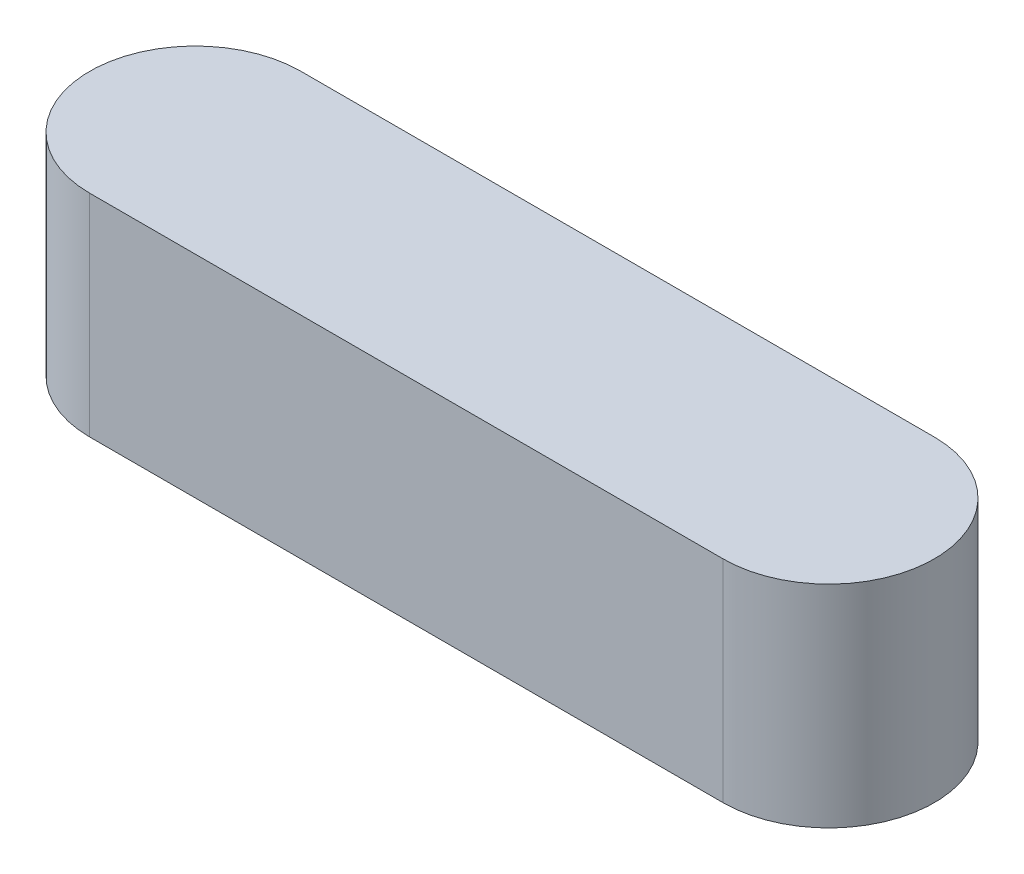
ISO-10303-21;
HEADER;
FILE_DESCRIPTION(('STEP AP214'),'2;1');
FILE_NAME('part.step','',(''),(''),'','','');
FILE_SCHEMA(('AUTOMOTIVE_DESIGN { 1 0 10303 214 1 1 1 1 }'));
ENDSEC;
DATA;
#1=APPLICATION_CONTEXT('core data for automotive mechanical design processes');
#2=APPLICATION_PROTOCOL_DEFINITION('international standard','automotive_design',2000,#1);
#3=PRODUCT_CONTEXT('',#1,'mechanical');
#4=PRODUCT('Part','Part','',(#3));
#5=PRODUCT_RELATED_PRODUCT_CATEGORY('part','',(#4));
#6=PRODUCT_DEFINITION_FORMATION('','',#4);
#7=PRODUCT_DEFINITION_CONTEXT('part definition',#1,'design');
#8=PRODUCT_DEFINITION('design','',#6,#7);
#9=PRODUCT_DEFINITION_SHAPE('','',#8);
#10=(LENGTH_UNIT() NAMED_UNIT(*) SI_UNIT(.MILLI.,.METRE.));
#11=(NAMED_UNIT(*) PLANE_ANGLE_UNIT() SI_UNIT($,.RADIAN.));
#12=(NAMED_UNIT(*) SI_UNIT($,.STERADIAN.) SOLID_ANGLE_UNIT());
#13=UNCERTAINTY_MEASURE_WITH_UNIT(LENGTH_MEASURE(1.E-05),#10,'distance_accuracy_value','');
#14=(GEOMETRIC_REPRESENTATION_CONTEXT(3) GLOBAL_UNCERTAINTY_ASSIGNED_CONTEXT((#13)) GLOBAL_UNIT_ASSIGNED_CONTEXT((#10,
#11,#12)) REPRESENTATION_CONTEXT('',''));
#15=CARTESIAN_POINT('',(0.,0.,0.));
#16=DIRECTION('',(0.,0.,1.));
#17=DIRECTION('',(1.,0.,0.));
#18=AXIS2_PLACEMENT_3D('',#15,#16,#17);
#19=CARTESIAN_POINT('',(0.,3.,0.));
#20=DIRECTION('',(0.,-1.,0.));
#21=DIRECTION('',(0.,0.,-1.));
#22=AXIS2_PLACEMENT_3D('',#19,#20,#21);
#23=CYLINDRICAL_SURFACE('',#22,1.5);
#24=CARTESIAN_POINT('',(0.,0.,0.));
#25=DIRECTION('',(0.,1.,0.));
#26=DIRECTION('',(0.,0.,1.));
#27=AXIS2_PLACEMENT_3D('',#24,#25,#26);
#28=CIRCLE('',#27,1.5);
#29=CARTESIAN_POINT('',(0.,0.,-1.5));
#30=VERTEX_POINT('',#29);
#31=CARTESIAN_POINT('',(0.,0.,1.5));
#32=VERTEX_POINT('',#31);
#33=EDGE_CURVE('E97',#30,#32,#28,.T.);
#34=ORIENTED_EDGE('',*,*,#33,.T.);
#35=DIRECTION('',(0.,-1.,0.));
#36=VECTOR('',#35,1.);
#37=CARTESIAN_POINT('',(0.,3.,1.5));
#38=LINE('',#37,#36);
#39=CARTESIAN_POINT('',(0.,3.,1.5));
#40=VERTEX_POINT('',#39);
#41=EDGE_CURVE('E11',#40,#32,#38,.T.);
#42=ORIENTED_EDGE('',*,*,#41,.F.);
#43=CARTESIAN_POINT('',(0.,3.,0.));
#44=DIRECTION('',(0.,1.,0.));
#45=DIRECTION('',(0.,0.,1.));
#46=AXIS2_PLACEMENT_3D('',#43,#44,#45);
#47=CIRCLE('',#46,1.5);
#48=CARTESIAN_POINT('',(0.,3.,-1.5));
#49=VERTEX_POINT('',#48);
#50=EDGE_CURVE('E85',#49,#40,#47,.T.);
#51=ORIENTED_EDGE('',*,*,#50,.F.);
#52=DIRECTION('',(0.,-1.,0.));
#53=VECTOR('',#52,1.);
#54=CARTESIAN_POINT('',(0.,3.,-1.5));
#55=LINE('',#54,#53);
#56=EDGE_CURVE('E93',#49,#30,#55,.T.);
#57=ORIENTED_EDGE('',*,*,#56,.T.);
#58=EDGE_LOOP('',(#34,#42,#51,#57));
#59=FACE_BOUND('',#58,.T.);
#60=ADVANCED_FACE('F34',(#59),#23,.T.);
#61=CARTESIAN_POINT('',(0.,3.,1.5));
#62=DIRECTION('',(0.,0.,-1.));
#63=DIRECTION('',(-1.,0.,0.));
#64=AXIS2_PLACEMENT_3D('',#61,#62,#63);
#65=PLANE('',#64);
#66=DIRECTION('',(1.,0.,0.));
#67=VECTOR('',#66,1.);
#68=CARTESIAN_POINT('',(0.,0.,1.5));
#69=LINE('',#68,#67);
#70=CARTESIAN_POINT('',(9.,0.,1.5));
#71=VERTEX_POINT('',#70);
#72=EDGE_CURVE('E89',#32,#71,#69,.T.);
#73=ORIENTED_EDGE('',*,*,#72,.T.);
#74=DIRECTION('',(0.,-1.,0.));
#75=VECTOR('',#74,1.);
#76=CARTESIAN_POINT('',(9.,3.,1.5));
#77=LINE('',#76,#75);
#78=CARTESIAN_POINT('',(9.,3.,1.5));
#79=VERTEX_POINT('',#78);
#80=EDGE_CURVE('E42',#79,#71,#77,.T.);
#81=ORIENTED_EDGE('',*,*,#80,.F.);
#82=DIRECTION('',(1.,0.,0.));
#83=VECTOR('',#82,1.);
#84=CARTESIAN_POINT('',(0.,3.,1.5));
#85=LINE('',#84,#83);
#86=EDGE_CURVE('E80',#40,#79,#85,.T.);
#87=ORIENTED_EDGE('',*,*,#86,.F.);
#88=ORIENTED_EDGE('',*,*,#41,.T.);
#89=EDGE_LOOP('',(#73,#81,#87,#88));
#90=FACE_BOUND('',#89,.T.);
#91=ADVANCED_FACE('F88',(#90),#65,.F.);
#92=CARTESIAN_POINT('',(9.,3.,0.));
#93=DIRECTION('',(0.,-1.,0.));
#94=DIRECTION('',(0.,0.,-1.));
#95=AXIS2_PLACEMENT_3D('',#92,#93,#94);
#96=CYLINDRICAL_SURFACE('',#95,1.5);
#97=CARTESIAN_POINT('',(9.,0.,0.));
#98=DIRECTION('',(0.,1.,0.));
#99=DIRECTION('',(0.,0.,1.));
#100=AXIS2_PLACEMENT_3D('',#97,#98,#99);
#101=CIRCLE('',#100,1.5);
#102=CARTESIAN_POINT('',(9.,0.,-1.5));
#103=VERTEX_POINT('',#102);
#104=EDGE_CURVE('E67',#71,#103,#101,.T.);
#105=ORIENTED_EDGE('',*,*,#104,.T.);
#106=DIRECTION('',(0.,-1.,0.));
#107=VECTOR('',#106,1.);
#108=CARTESIAN_POINT('',(9.,3.,-1.5));
#109=LINE('',#108,#107);
#110=CARTESIAN_POINT('',(9.,3.,-1.5));
#111=VERTEX_POINT('',#110);
#112=EDGE_CURVE('E90',#111,#103,#109,.T.);
#113=ORIENTED_EDGE('',*,*,#112,.F.);
#114=CARTESIAN_POINT('',(9.,3.,0.));
#115=DIRECTION('',(0.,1.,0.));
#116=DIRECTION('',(0.,0.,1.));
#117=AXIS2_PLACEMENT_3D('',#114,#115,#116);
#118=CIRCLE('',#117,1.5);
#119=EDGE_CURVE('E83',#79,#111,#118,.T.);
#120=ORIENTED_EDGE('',*,*,#119,.F.);
#121=ORIENTED_EDGE('',*,*,#80,.T.);
#122=EDGE_LOOP('',(#105,#113,#120,#121));
#123=FACE_BOUND('',#122,.T.);
#124=ADVANCED_FACE('F91',(#123),#96,.T.);
#125=CARTESIAN_POINT('',(0.,3.,-1.5));
#126=DIRECTION('',(0.,0.,1.));
#127=DIRECTION('',(1.,0.,0.));
#128=AXIS2_PLACEMENT_3D('',#125,#126,#127);
#129=PLANE('',#128);
#130=DIRECTION('',(-1.,0.,0.));
#131=VECTOR('',#130,1.);
#132=CARTESIAN_POINT('',(0.,0.,-1.5));
#133=LINE('',#132,#131);
#134=EDGE_CURVE('E73',#103,#30,#133,.T.);
#135=ORIENTED_EDGE('',*,*,#134,.T.);
#136=ORIENTED_EDGE('',*,*,#56,.F.);
#137=DIRECTION('',(-1.,0.,0.));
#138=VECTOR('',#137,1.);
#139=CARTESIAN_POINT('',(0.,3.,-1.5));
#140=LINE('',#139,#138);
#141=EDGE_CURVE('E50',#111,#49,#140,.T.);
#142=ORIENTED_EDGE('',*,*,#141,.F.);
#143=ORIENTED_EDGE('',*,*,#112,.T.);
#144=EDGE_LOOP('',(#135,#136,#142,#143));
#145=FACE_BOUND('',#144,.T.);
#146=ADVANCED_FACE('F104',(#145),#129,.F.);
#147=CARTESIAN_POINT('',(0.,3.,0.));
#148=DIRECTION('',(0.,1.,0.));
#149=DIRECTION('',(0.,0.,1.));
#150=AXIS2_PLACEMENT_3D('',#147,#148,#149);
#151=PLANE('',#150);
#152=ORIENTED_EDGE('',*,*,#50,.T.);
#153=ORIENTED_EDGE('',*,*,#86,.T.);
#154=ORIENTED_EDGE('',*,*,#119,.T.);
#155=ORIENTED_EDGE('',*,*,#141,.T.);
#156=EDGE_LOOP('',(#152,#153,#154,#155));
#157=FACE_BOUND('',#156,.T.);
#158=ADVANCED_FACE('F81',(#157),#151,.T.);
#159=CARTESIAN_POINT('',(0.,0.,0.));
#160=DIRECTION('',(0.,1.,0.));
#161=DIRECTION('',(0.,0.,1.));
#162=AXIS2_PLACEMENT_3D('',#159,#160,#161);
#163=PLANE('',#162);
#164=ORIENTED_EDGE('',*,*,#33,.F.);
#165=ORIENTED_EDGE('',*,*,#134,.F.);
#166=ORIENTED_EDGE('',*,*,#104,.F.);
#167=ORIENTED_EDGE('',*,*,#72,.F.);
#168=EDGE_LOOP('',(#164,#165,#166,#167));
#169=FACE_BOUND('',#168,.T.);
#170=ADVANCED_FACE('F107',(#169),#163,.F.);
#171=CLOSED_SHELL('',(#60,#91,#124,#146,#158,#170));
#172=MANIFOLD_SOLID_BREP('B2',#171);
#173=ADVANCED_BREP_SHAPE_REPRESENTATION('',(#18,#172),#14);
#174=SHAPE_DEFINITION_REPRESENTATION(#9,#173);
ENDSEC;
END-ISO-10303-21;
